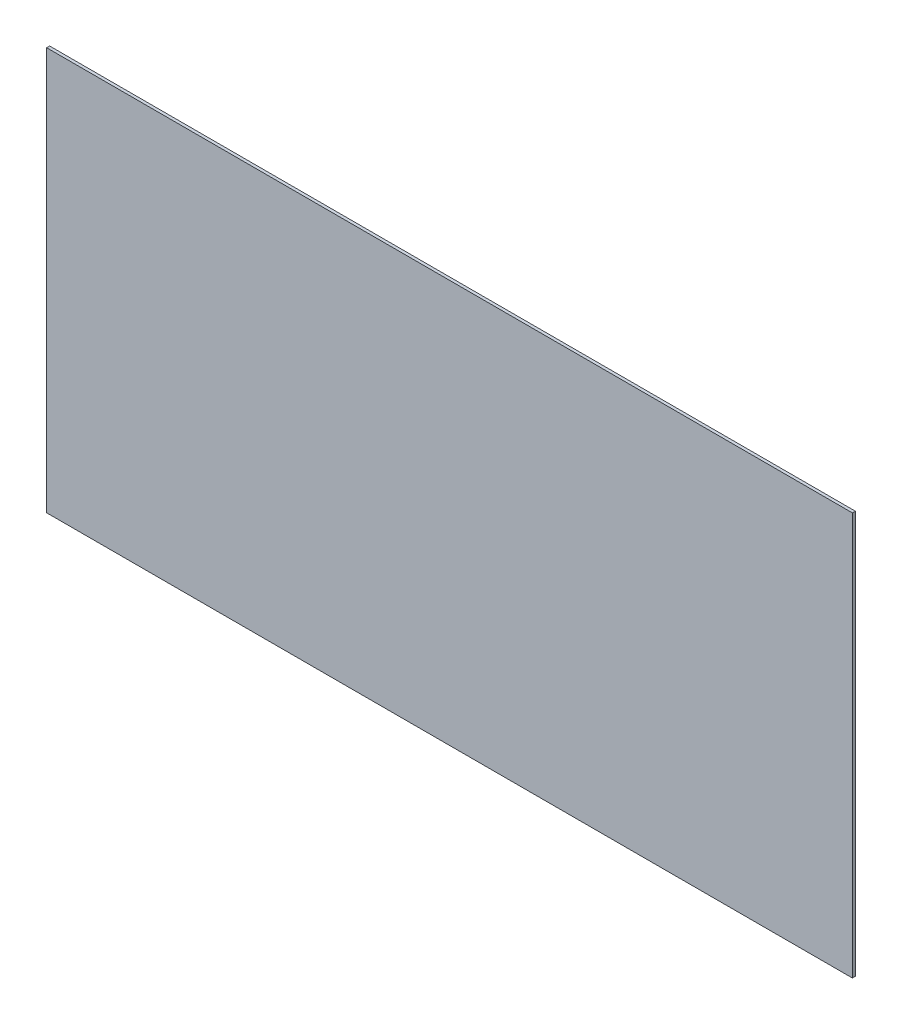
ISO-10303-21;
HEADER;
FILE_DESCRIPTION(('STEP AP214'),'2;1');
FILE_NAME('part.step','',(''),(''),'','','');
FILE_SCHEMA(('AUTOMOTIVE_DESIGN { 1 0 10303 214 1 1 1 1 }'));
ENDSEC;
DATA;
#1=APPLICATION_CONTEXT('core data for automotive mechanical design processes');
#2=APPLICATION_PROTOCOL_DEFINITION('international standard','automotive_design',2000,#1);
#3=PRODUCT_CONTEXT('',#1,'mechanical');
#4=PRODUCT('Part','Part','',(#3));
#5=PRODUCT_RELATED_PRODUCT_CATEGORY('part','',(#4));
#6=PRODUCT_DEFINITION_FORMATION('','',#4);
#7=PRODUCT_DEFINITION_CONTEXT('part definition',#1,'design');
#8=PRODUCT_DEFINITION('design','',#6,#7);
#9=PRODUCT_DEFINITION_SHAPE('','',#8);
#10=(LENGTH_UNIT() NAMED_UNIT(*) SI_UNIT(.MILLI.,.METRE.));
#11=(NAMED_UNIT(*) PLANE_ANGLE_UNIT() SI_UNIT($,.RADIAN.));
#12=(NAMED_UNIT(*) SI_UNIT($,.STERADIAN.) SOLID_ANGLE_UNIT());
#13=UNCERTAINTY_MEASURE_WITH_UNIT(LENGTH_MEASURE(1.E-05),#10,'distance_accuracy_value','');
#14=(GEOMETRIC_REPRESENTATION_CONTEXT(3) GLOBAL_UNCERTAINTY_ASSIGNED_CONTEXT((#13)) GLOBAL_UNIT_ASSIGNED_CONTEXT((#10,
#11,#12)) REPRESENTATION_CONTEXT('',''));
#15=CARTESIAN_POINT('',(0.,0.,0.));
#16=DIRECTION('',(0.,0.,1.));
#17=DIRECTION('',(1.,0.,0.));
#18=AXIS2_PLACEMENT_3D('',#15,#16,#17);
#19=CARTESIAN_POINT('',(0.,4.99999999999998,0.07366));
#20=DIRECTION('',(1.,0.,0.));
#21=DIRECTION('',(0.,1.,0.));
#22=AXIS2_PLACEMENT_3D('',#19,#20,#21);
#23=PLANE('',#22);
#24=DIRECTION('',(0.,-1.,0.));
#25=VECTOR('',#24,1.);
#26=CARTESIAN_POINT('',(0.,4.99999999999998,0.));
#27=LINE('',#26,#25);
#28=CARTESIAN_POINT('',(0.,4.99999999999998,0.));
#29=VERTEX_POINT('',#28);
#30=CARTESIAN_POINT('',(0.,-5.,0.));
#31=VERTEX_POINT('',#30);
#32=EDGE_CURVE('E113',#29,#31,#27,.T.);
#33=ORIENTED_EDGE('',*,*,#32,.T.);
#34=DIRECTION('',(0.,0.,-1.));
#35=VECTOR('',#34,1.);
#36=CARTESIAN_POINT('',(0.,-5.,0.07366));
#37=LINE('',#36,#35);
#38=CARTESIAN_POINT('',(0.,-5.,0.07366));
#39=VERTEX_POINT('',#38);
#40=EDGE_CURVE('E11',#39,#31,#37,.T.);
#41=ORIENTED_EDGE('',*,*,#40,.F.);
#42=DIRECTION('',(0.,-1.,0.));
#43=VECTOR('',#42,1.);
#44=CARTESIAN_POINT('',(0.,4.99999999999998,0.07366));
#45=LINE('',#44,#43);
#46=CARTESIAN_POINT('',(0.,4.99999999999998,0.07366));
#47=VERTEX_POINT('',#46);
#48=EDGE_CURVE('E97',#47,#39,#45,.T.);
#49=ORIENTED_EDGE('',*,*,#48,.F.);
#50=DIRECTION('',(0.,0.,-1.));
#51=VECTOR('',#50,1.);
#52=CARTESIAN_POINT('',(0.,4.99999999999998,0.07366));
#53=LINE('',#52,#51);
#54=EDGE_CURVE('E109',#47,#29,#53,.T.);
#55=ORIENTED_EDGE('',*,*,#54,.T.);
#56=EDGE_LOOP('',(#33,#41,#49,#55));
#57=FACE_BOUND('',#56,.T.);
#58=ADVANCED_FACE('F45',(#57),#23,.F.);
#59=CARTESIAN_POINT('',(0.,-5.,0.07366));
#60=DIRECTION('',(0.,1.,0.));
#61=DIRECTION('',(0.,0.,1.));
#62=AXIS2_PLACEMENT_3D('',#59,#60,#61);
#63=PLANE('',#62);
#64=DIRECTION('',(1.,0.,0.));
#65=VECTOR('',#64,1.);
#66=CARTESIAN_POINT('',(0.,-5.,0.));
#67=LINE('',#66,#65);
#68=CARTESIAN_POINT('',(20.,-5.,0.));
#69=VERTEX_POINT('',#68);
#70=EDGE_CURVE('E102',#31,#69,#67,.T.);
#71=ORIENTED_EDGE('',*,*,#70,.T.);
#72=DIRECTION('',(0.,0.,-1.));
#73=VECTOR('',#72,1.);
#74=CARTESIAN_POINT('',(20.,-5.,0.07366));
#75=LINE('',#74,#73);
#76=CARTESIAN_POINT('',(20.,-5.,0.07366));
#77=VERTEX_POINT('',#76);
#78=EDGE_CURVE('E54',#77,#69,#75,.T.);
#79=ORIENTED_EDGE('',*,*,#78,.F.);
#80=DIRECTION('',(1.,0.,0.));
#81=VECTOR('',#80,1.);
#82=CARTESIAN_POINT('',(0.,-5.,0.07366));
#83=LINE('',#82,#81);
#84=EDGE_CURVE('E92',#39,#77,#83,.T.);
#85=ORIENTED_EDGE('',*,*,#84,.F.);
#86=ORIENTED_EDGE('',*,*,#40,.T.);
#87=EDGE_LOOP('',(#71,#79,#85,#86));
#88=FACE_BOUND('',#87,.T.);
#89=ADVANCED_FACE('F101',(#88),#63,.F.);
#90=CARTESIAN_POINT('',(20.,5.,0.07366));
#91=DIRECTION('',(-1.,0.,0.));
#92=DIRECTION('',(0.,-1.,0.));
#93=AXIS2_PLACEMENT_3D('',#90,#91,#92);
#94=PLANE('',#93);
#95=DIRECTION('',(0.,1.,0.));
#96=VECTOR('',#95,1.);
#97=CARTESIAN_POINT('',(20.,5.,0.));
#98=LINE('',#97,#96);
#99=CARTESIAN_POINT('',(20.,5.,0.));
#100=VERTEX_POINT('',#99);
#101=EDGE_CURVE('E79',#69,#100,#98,.T.);
#102=ORIENTED_EDGE('',*,*,#101,.T.);
#103=DIRECTION('',(0.,0.,-1.));
#104=VECTOR('',#103,1.);
#105=CARTESIAN_POINT('',(20.,5.,0.07366));
#106=LINE('',#105,#104);
#107=CARTESIAN_POINT('',(20.,5.,0.07366));
#108=VERTEX_POINT('',#107);
#109=EDGE_CURVE('E104',#108,#100,#106,.T.);
#110=ORIENTED_EDGE('',*,*,#109,.F.);
#111=DIRECTION('',(0.,1.,0.));
#112=VECTOR('',#111,1.);
#113=CARTESIAN_POINT('',(20.,5.,0.07366));
#114=LINE('',#113,#112);
#115=EDGE_CURVE('E95',#77,#108,#114,.T.);
#116=ORIENTED_EDGE('',*,*,#115,.F.);
#117=ORIENTED_EDGE('',*,*,#78,.T.);
#118=EDGE_LOOP('',(#102,#110,#116,#117));
#119=FACE_BOUND('',#118,.T.);
#120=ADVANCED_FACE('F105',(#119),#94,.F.);
#121=CARTESIAN_POINT('',(0.,4.99999999999998,0.07366));
#122=DIRECTION('',(0.,-1.,0.));
#123=DIRECTION('',(1.,0.,0.));
#124=AXIS2_PLACEMENT_3D('',#121,#122,#123);
#125=PLANE('',#124);
#126=DIRECTION('',(-1.,0.,0.));
#127=VECTOR('',#126,1.);
#128=CARTESIAN_POINT('',(0.,4.99999999999998,0.));
#129=LINE('',#128,#127);
#130=EDGE_CURVE('E85',#100,#29,#129,.T.);
#131=ORIENTED_EDGE('',*,*,#130,.T.);
#132=ORIENTED_EDGE('',*,*,#54,.F.);
#133=DIRECTION('',(-1.,0.,0.));
#134=VECTOR('',#133,1.);
#135=CARTESIAN_POINT('',(0.,4.99999999999998,0.07366));
#136=LINE('',#135,#134);
#137=EDGE_CURVE('E62',#108,#47,#136,.T.);
#138=ORIENTED_EDGE('',*,*,#137,.F.);
#139=ORIENTED_EDGE('',*,*,#109,.T.);
#140=EDGE_LOOP('',(#131,#132,#138,#139));
#141=FACE_BOUND('',#140,.T.);
#142=ADVANCED_FACE('F126',(#141),#125,.F.);
#143=CARTESIAN_POINT('',(0.,0.,0.07366));
#144=DIRECTION('',(0.,0.,1.));
#145=DIRECTION('',(1.,0.,0.));
#146=AXIS2_PLACEMENT_3D('',#143,#144,#145);
#147=PLANE('',#146);
#148=ORIENTED_EDGE('',*,*,#48,.T.);
#149=ORIENTED_EDGE('',*,*,#84,.T.);
#150=ORIENTED_EDGE('',*,*,#115,.T.);
#151=ORIENTED_EDGE('',*,*,#137,.T.);
#152=EDGE_LOOP('',(#148,#149,#150,#151));
#153=FACE_BOUND('',#152,.T.);
#154=ADVANCED_FACE('F93',(#153),#147,.T.);
#155=CARTESIAN_POINT('',(0.,0.,0.));
#156=DIRECTION('',(0.,0.,1.));
#157=DIRECTION('',(1.,0.,0.));
#158=AXIS2_PLACEMENT_3D('',#155,#156,#157);
#159=PLANE('',#158);
#160=ORIENTED_EDGE('',*,*,#32,.F.);
#161=ORIENTED_EDGE('',*,*,#130,.F.);
#162=ORIENTED_EDGE('',*,*,#101,.F.);
#163=ORIENTED_EDGE('',*,*,#70,.F.);
#164=EDGE_LOOP('',(#160,#161,#162,#163));
#165=FACE_BOUND('',#164,.T.);
#166=ADVANCED_FACE('F129',(#165),#159,.F.);
#167=CLOSED_SHELL('',(#58,#89,#120,#142,#154,#166));
#168=MANIFOLD_SOLID_BREP('B2',#167);
#169=ADVANCED_BREP_SHAPE_REPRESENTATION('',(#18,#168),#14);
#170=SHAPE_DEFINITION_REPRESENTATION(#9,#169);
ENDSEC;
END-ISO-10303-21;
